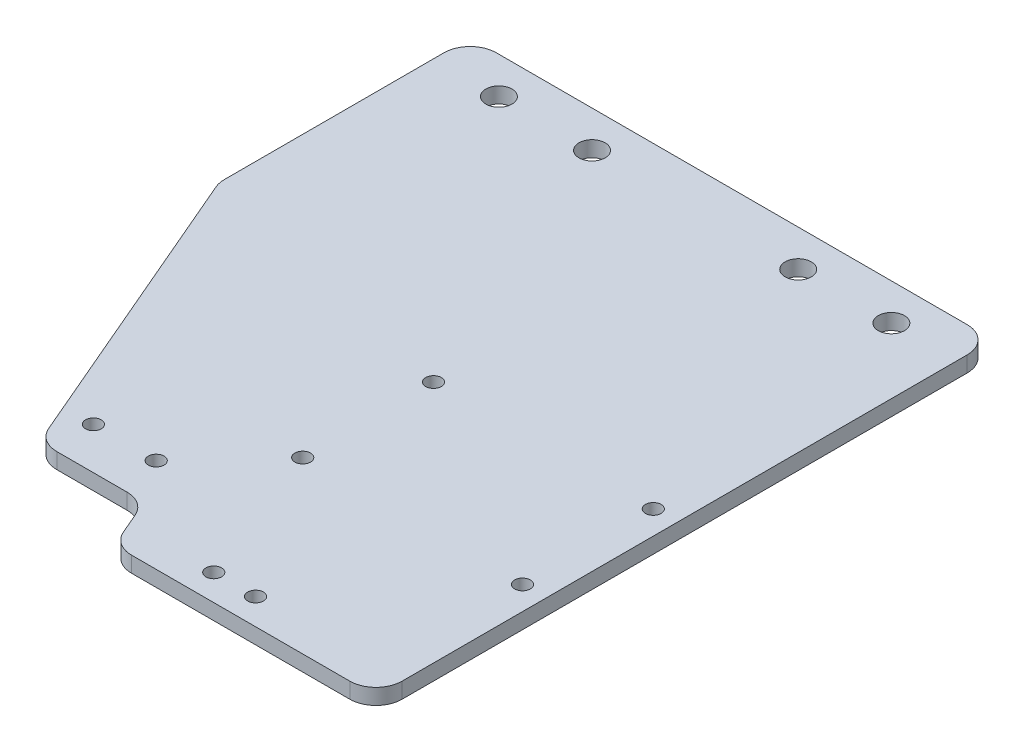
ISO-10303-21;
HEADER;
FILE_DESCRIPTION(('STEP AP214'),'2;1');
FILE_NAME('part.step','',(''),(''),'','','');
FILE_SCHEMA(('AUTOMOTIVE_DESIGN { 1 0 10303 214 1 1 1 1 }'));
ENDSEC;
DATA;
#1=APPLICATION_CONTEXT('core data for automotive mechanical design processes');
#2=APPLICATION_PROTOCOL_DEFINITION('international standard','automotive_design',2000,#1);
#3=PRODUCT_CONTEXT('',#1,'mechanical');
#4=PRODUCT('Part','Part','',(#3));
#5=PRODUCT_RELATED_PRODUCT_CATEGORY('part','',(#4));
#6=PRODUCT_DEFINITION_FORMATION('','',#4);
#7=PRODUCT_DEFINITION_CONTEXT('part definition',#1,'design');
#8=PRODUCT_DEFINITION('design','',#6,#7);
#9=PRODUCT_DEFINITION_SHAPE('','',#8);
#10=(LENGTH_UNIT() NAMED_UNIT(*) SI_UNIT(.MILLI.,.METRE.));
#11=(NAMED_UNIT(*) PLANE_ANGLE_UNIT() SI_UNIT($,.RADIAN.));
#12=(NAMED_UNIT(*) SI_UNIT($,.STERADIAN.) SOLID_ANGLE_UNIT());
#13=UNCERTAINTY_MEASURE_WITH_UNIT(LENGTH_MEASURE(1.E-05),#10,'distance_accuracy_value','');
#14=(GEOMETRIC_REPRESENTATION_CONTEXT(3) GLOBAL_UNCERTAINTY_ASSIGNED_CONTEXT((#13)) GLOBAL_UNIT_ASSIGNED_CONTEXT((#10,
#11,#12)) REPRESENTATION_CONTEXT('',''));
#15=CARTESIAN_POINT('',(0.,0.,0.));
#16=DIRECTION('',(0.,0.,1.));
#17=DIRECTION('',(1.,0.,0.));
#18=AXIS2_PLACEMENT_3D('',#15,#16,#17);
#19=CARTESIAN_POINT('',(-50.,3.,59.));
#20=DIRECTION('',(0.,0.,-1.));
#21=DIRECTION('',(-1.,0.,0.));
#22=AXIS2_PLACEMENT_3D('',#19,#20,#21);
#23=PLANE('',#22);
#24=DIRECTION('',(1.,0.,0.));
#25=VECTOR('',#24,1.);
#26=CARTESIAN_POINT('',(-50.,3.,59.));
#27=LINE('',#26,#25);
#28=CARTESIAN_POINT('',(3.29698078990277,3.,59.));
#29=VERTEX_POINT('',#28);
#30=CARTESIAN_POINT('',(45.,3.,59.));
#31=VERTEX_POINT('',#30);
#32=EDGE_CURVE('E188',#29,#31,#27,.T.);
#33=ORIENTED_EDGE('',*,*,#32,.F.);
#34=DIRECTION('',(0.,1.,0.));
#35=VECTOR('',#34,1.);
#36=CARTESIAN_POINT('',(3.29698078990278,0.,59.));
#37=LINE('',#36,#35);
#38=CARTESIAN_POINT('',(3.29698078990277,0.,59.));
#39=VERTEX_POINT('',#38);
#40=EDGE_CURVE('E229',#29,#39,#37,.F.);
#41=ORIENTED_EDGE('',*,*,#40,.T.);
#42=DIRECTION('',(1.,0.,0.));
#43=VECTOR('',#42,1.);
#44=CARTESIAN_POINT('',(-50.,0.,59.));
#45=LINE('',#44,#43);
#46=CARTESIAN_POINT('',(45.,0.,59.));
#47=VERTEX_POINT('',#46);
#48=EDGE_CURVE('E169',#39,#47,#45,.T.);
#49=ORIENTED_EDGE('',*,*,#48,.T.);
#50=DIRECTION('',(0.,-1.,0.));
#51=VECTOR('',#50,1.);
#52=CARTESIAN_POINT('',(45.,3.,59.));
#53=LINE('',#52,#51);
#54=EDGE_CURVE('E227',#47,#31,#53,.F.);
#55=ORIENTED_EDGE('',*,*,#54,.T.);
#56=EDGE_LOOP('',(#33,#41,#49,#55));
#57=FACE_BOUND('',#56,.T.);
#58=ADVANCED_FACE('F38',(#57),#23,.F.);
#59=CARTESIAN_POINT('',(0.,3.,0.));
#60=DIRECTION('',(0.,1.,0.));
#61=DIRECTION('',(0.,0.,1.));
#62=AXIS2_PLACEMENT_3D('',#59,#60,#61);
#63=PLANE('',#62);
#64=CARTESIAN_POINT('',(-10.,3.,41.));
#65=DIRECTION('',(0.,1.,0.));
#66=DIRECTION('',(0.,0.,-1.));
#67=AXIS2_PLACEMENT_3D('',#64,#65,#66);
#68=CIRCLE('',#67,1.5);
#69=CARTESIAN_POINT('',(-10.,3.,39.5));
#70=VERTEX_POINT('',#69);
#71=EDGE_CURVE('E187',#70,#70,#68,.T.);
#72=ORIENTED_EDGE('',*,*,#71,.F.);
#73=EDGE_LOOP('',(#72));
#74=FACE_BOUND('',#73,.T.);
#75=CARTESIAN_POINT('',(-22.,3.,41.));
#76=DIRECTION('',(0.,1.,0.));
#77=DIRECTION('',(0.,0.,1.));
#78=AXIS2_PLACEMENT_3D('',#75,#76,#77);
#79=CIRCLE('',#78,1.5);
#80=CARTESIAN_POINT('',(-22.,3.,42.5));
#81=VERTEX_POINT('',#80);
#82=EDGE_CURVE('E183',#81,#81,#79,.T.);
#83=ORIENTED_EDGE('',*,*,#82,.F.);
#84=EDGE_LOOP('',(#83));
#85=FACE_BOUND('',#84,.T.);
#86=DIRECTION('',(-1.,0.,0.));
#87=VECTOR('',#86,1.);
#88=CARTESIAN_POINT('',(-50.,3.,-59.));
#89=LINE('',#88,#87);
#90=CARTESIAN_POINT('',(44.9999999999999,3.,-59.));
#91=VERTEX_POINT('',#90);
#92=CARTESIAN_POINT('',(-45.,3.,-59.));
#93=VERTEX_POINT('',#92);
#94=EDGE_CURVE('E332',#91,#93,#89,.T.);
#95=ORIENTED_EDGE('',*,*,#94,.T.);
#96=CARTESIAN_POINT('',(-45.,3.,-54.));
#97=DIRECTION('',(0.,1.,0.));
#98=DIRECTION('',(0.,0.,1.));
#99=AXIS2_PLACEMENT_3D('',#96,#97,#98);
#100=CIRCLE('',#99,5.);
#101=CARTESIAN_POINT('',(-50.,3.,-54.));
#102=VERTEX_POINT('',#101);
#103=EDGE_CURVE('E210',#93,#102,#100,.T.);
#104=ORIENTED_EDGE('',*,*,#103,.T.);
#105=DIRECTION('',(0.,0.,1.));
#106=VECTOR('',#105,1.);
#107=CARTESIAN_POINT('',(-50.,3.,-59.));
#108=LINE('',#107,#106);
#109=CARTESIAN_POINT('',(-50.,3.,-12.0262885097732));
#110=VERTEX_POINT('',#109);
#111=EDGE_CURVE('E161',#102,#110,#108,.T.);
#112=ORIENTED_EDGE('',*,*,#111,.T.);
#113=CARTESIAN_POINT('',(-45.,3.,-12.0262885097732));
#114=DIRECTION('',(0.,1.,0.));
#115=DIRECTION('',(0.,0.,1.));
#116=AXIS2_PLACEMENT_3D('',#113,#114,#115);
#117=CIRCLE('',#116,5.);
#118=CARTESIAN_POINT('',(-49.5957251500903,3.,-10.0566920168774));
#119=VERTEX_POINT('',#118);
#120=EDGE_CURVE('E208',#110,#119,#117,.T.);
#121=ORIENTED_EDGE('',*,*,#120,.T.);
#122=DIRECTION('',(-0.393919298579168,0.,-0.919145030018058));
#123=VECTOR('',#122,1.);
#124=CARTESIAN_POINT('',(-38.2586206896552,3.,16.3965517241379));
#125=LINE('',#124,#123);
#126=CARTESIAN_POINT('',(-25.5844586459018,3.,45.9695964928958));
#127=VERTEX_POINT('',#126);
#128=EDGE_CURVE('E265',#127,#119,#125,.T.);
#129=ORIENTED_EDGE('',*,*,#128,.F.);
#130=CARTESIAN_POINT('',(-20.9887334958115,3.,44.));
#131=DIRECTION('',(0.,1.,0.));
#132=DIRECTION('',(0.,0.,1.));
#133=AXIS2_PLACEMENT_3D('',#130,#131,#132);
#134=CIRCLE('',#133,5.);
#135=CARTESIAN_POINT('',(-20.9887334958115,3.,49.));
#136=VERTEX_POINT('',#135);
#137=EDGE_CURVE('E206',#127,#136,#134,.T.);
#138=ORIENTED_EDGE('',*,*,#137,.T.);
#139=DIRECTION('',(1.,0.,0.));
#140=VECTOR('',#139,1.);
#141=CARTESIAN_POINT('',(0.,3.,49.));
#142=LINE('',#141,#140);
#143=CARTESIAN_POINT('',(-7.5826950756171,3.,49.));
#144=VERTEX_POINT('',#143);
#145=EDGE_CURVE('E241',#136,#144,#142,.T.);
#146=ORIENTED_EDGE('',*,*,#145,.T.);
#147=CARTESIAN_POINT('',(-7.58269507561709,3.,54.));
#148=DIRECTION('',(0.,1.,0.));
#149=DIRECTION('',(0.,0.,1.));
#150=AXIS2_PLACEMENT_3D('',#147,#148,#149);
#151=CIRCLE('',#150,5.);
#152=CARTESIAN_POINT('',(-2.9869699255268,3.,52.0304035071042));
#153=VERTEX_POINT('',#152);
#154=EDGE_CURVE('E46',#144,#153,#151,.F.);
#155=ORIENTED_EDGE('',*,*,#154,.T.);
#156=DIRECTION('',(0.393919298579168,0.,0.919145030018058));
#157=VECTOR('',#156,1.);
#158=CARTESIAN_POINT('',(-21.3620689655172,3.,9.1551724137931));
#159=LINE('',#158,#157);
#160=CARTESIAN_POINT('',(-1.29874436018751,3.,55.9695964928958));
#161=VERTEX_POINT('',#160);
#162=EDGE_CURVE('E182',#153,#161,#159,.T.);
#163=ORIENTED_EDGE('',*,*,#162,.T.);
#164=CARTESIAN_POINT('',(3.29698078990278,3.,54.));
#165=DIRECTION('',(0.,1.,0.));
#166=DIRECTION('',(0.,0.,1.));
#167=AXIS2_PLACEMENT_3D('',#164,#165,#166);
#168=CIRCLE('',#167,5.);
#169=EDGE_CURVE('E204',#161,#29,#168,.T.);
#170=ORIENTED_EDGE('',*,*,#169,.T.);
#171=ORIENTED_EDGE('',*,*,#32,.T.);
#172=CARTESIAN_POINT('',(45.,3.,54.));
#173=DIRECTION('',(0.,1.,0.));
#174=DIRECTION('',(0.,0.,1.));
#175=AXIS2_PLACEMENT_3D('',#172,#173,#174);
#176=CIRCLE('',#175,5.);
#177=CARTESIAN_POINT('',(50.,3.,54.));
#178=VERTEX_POINT('',#177);
#179=EDGE_CURVE('E60',#31,#178,#176,.T.);
#180=ORIENTED_EDGE('',*,*,#179,.T.);
#181=DIRECTION('',(0.,0.,-1.));
#182=VECTOR('',#181,1.);
#183=CARTESIAN_POINT('',(50.,3.,-59.));
#184=LINE('',#183,#182);
#185=CARTESIAN_POINT('',(50.,3.,-54.));
#186=VERTEX_POINT('',#185);
#187=EDGE_CURVE('E173',#178,#186,#184,.T.);
#188=ORIENTED_EDGE('',*,*,#187,.T.);
#189=CARTESIAN_POINT('',(45.,3.,-54.));
#190=DIRECTION('',(0.,1.,0.));
#191=DIRECTION('',(0.,0.,1.));
#192=AXIS2_PLACEMENT_3D('',#189,#190,#191);
#193=CIRCLE('',#192,5.);
#194=EDGE_CURVE('E201',#186,#91,#193,.T.);
#195=ORIENTED_EDGE('',*,*,#194,.T.);
#196=EDGE_LOOP('',(#95,#104,#112,#121,#129,#138,#146,#155,#163,#170,#171,#180,#188,#195));
#197=FACE_BOUND('',#196,.T.);
#198=CARTESIAN_POINT('',(14.,3.,54.));
#199=DIRECTION('',(0.,1.,0.));
#200=DIRECTION('',(0.,0.,-1.));
#201=AXIS2_PLACEMENT_3D('',#198,#199,#200);
#202=CIRCLE('',#201,1.5);
#203=CARTESIAN_POINT('',(14.,3.,52.5));
#204=VERTEX_POINT('',#203);
#205=EDGE_CURVE('E263',#204,#204,#202,.T.);
#206=ORIENTED_EDGE('',*,*,#205,.F.);
#207=EDGE_LOOP('',(#206));
#208=FACE_BOUND('',#207,.T.);
#209=CARTESIAN_POINT('',(22.,3.,54.));
#210=DIRECTION('',(0.,1.,0.));
#211=DIRECTION('',(0.,0.,1.));
#212=AXIS2_PLACEMENT_3D('',#209,#210,#211);
#213=CIRCLE('',#212,1.5);
#214=CARTESIAN_POINT('',(22.,3.,55.5));
#215=VERTEX_POINT('',#214);
#216=EDGE_CURVE('E275',#215,#215,#213,.T.);
#217=ORIENTED_EDGE('',*,*,#216,.F.);
#218=EDGE_LOOP('',(#217));
#219=FACE_BOUND('',#218,.T.);
#220=CARTESIAN_POINT('',(-37.5,3.,-52.));
#221=DIRECTION('',(0.,1.,0.));
#222=DIRECTION('',(0.,0.,-1.));
#223=AXIS2_PLACEMENT_3D('',#220,#221,#222);
#224=CIRCLE('',#223,2.5);
#225=CARTESIAN_POINT('',(-37.5,3.,-54.5));
#226=VERTEX_POINT('',#225);
#227=EDGE_CURVE('E281',#226,#226,#224,.T.);
#228=ORIENTED_EDGE('',*,*,#227,.F.);
#229=EDGE_LOOP('',(#228));
#230=FACE_BOUND('',#229,.T.);
#231=CARTESIAN_POINT('',(-19.7,3.,-52.));
#232=DIRECTION('',(0.,1.,0.));
#233=DIRECTION('',(0.,0.,1.));
#234=AXIS2_PLACEMENT_3D('',#231,#232,#233);
#235=CIRCLE('',#234,2.5);
#236=CARTESIAN_POINT('',(-19.7,3.,-49.5));
#237=VERTEX_POINT('',#236);
#238=EDGE_CURVE('E287',#237,#237,#235,.T.);
#239=ORIENTED_EDGE('',*,*,#238,.F.);
#240=EDGE_LOOP('',(#239));
#241=FACE_BOUND('',#240,.T.);
#242=CARTESIAN_POINT('',(19.7,3.,-52.));
#243=DIRECTION('',(0.,1.,0.));
#244=DIRECTION('',(0.,0.,-1.));
#245=AXIS2_PLACEMENT_3D('',#242,#243,#244);
#246=CIRCLE('',#245,2.5);
#247=CARTESIAN_POINT('',(19.7,3.,-54.5));
#248=VERTEX_POINT('',#247);
#249=EDGE_CURVE('E293',#248,#248,#246,.T.);
#250=ORIENTED_EDGE('',*,*,#249,.F.);
#251=EDGE_LOOP('',(#250));
#252=FACE_BOUND('',#251,.T.);
#253=CARTESIAN_POINT('',(37.5,3.,-52.));
#254=DIRECTION('',(0.,1.,0.));
#255=DIRECTION('',(0.,0.,1.));
#256=AXIS2_PLACEMENT_3D('',#253,#254,#255);
#257=CIRCLE('',#256,2.50000000000001);
#258=CARTESIAN_POINT('',(37.5,3.,-49.5));
#259=VERTEX_POINT('',#258);
#260=EDGE_CURVE('E299',#259,#259,#257,.T.);
#261=ORIENTED_EDGE('',*,*,#260,.F.);
#262=EDGE_LOOP('',(#261));
#263=FACE_BOUND('',#262,.T.);
#264=CARTESIAN_POINT('',(45.5,3.,1.49999999999999));
#265=DIRECTION('',(0.,-1.,0.));
#266=DIRECTION('',(0.,0.,-1.));
#267=AXIS2_PLACEMENT_3D('',#264,#265,#266);
#268=CIRCLE('',#267,1.5);
#269=CARTESIAN_POINT('',(45.5,3.,0.));
#270=VERTEX_POINT('',#269);
#271=EDGE_CURVE('E320',#270,#270,#268,.T.);
#272=ORIENTED_EDGE('',*,*,#271,.T.);
#273=EDGE_LOOP('',(#272));
#274=FACE_BOUND('',#273,.T.);
#275=CARTESIAN_POINT('',(3.49999999999999,3.,1.49999999999999));
#276=DIRECTION('',(0.,1.,0.));
#277=DIRECTION('',(0.,0.,1.));
#278=AXIS2_PLACEMENT_3D('',#275,#276,#277);
#279=CIRCLE('',#278,1.5);
#280=CARTESIAN_POINT('',(3.49999999999999,3.,2.99999999999999));
#281=VERTEX_POINT('',#280);
#282=EDGE_CURVE('E323',#281,#281,#279,.T.);
#283=ORIENTED_EDGE('',*,*,#282,.F.);
#284=EDGE_LOOP('',(#283));
#285=FACE_BOUND('',#284,.T.);
#286=CARTESIAN_POINT('',(45.5,3.,26.5));
#287=DIRECTION('',(0.,1.,0.));
#288=DIRECTION('',(0.,0.,1.));
#289=AXIS2_PLACEMENT_3D('',#286,#287,#288);
#290=CIRCLE('',#289,1.5);
#291=CARTESIAN_POINT('',(45.5,3.,28.));
#292=VERTEX_POINT('',#291);
#293=EDGE_CURVE('E314',#292,#292,#290,.T.);
#294=ORIENTED_EDGE('',*,*,#293,.F.);
#295=EDGE_LOOP('',(#294));
#296=FACE_BOUND('',#295,.T.);
#297=CARTESIAN_POINT('',(3.49999999999999,3.,26.5));
#298=DIRECTION('',(0.,-1.,0.));
#299=DIRECTION('',(0.,0.,-1.));
#300=AXIS2_PLACEMENT_3D('',#297,#298,#299);
#301=CIRCLE('',#300,1.49999999999999);
#302=CARTESIAN_POINT('',(3.49999999999999,3.,25.));
#303=VERTEX_POINT('',#302);
#304=EDGE_CURVE('E308',#303,#303,#301,.T.);
#305=ORIENTED_EDGE('',*,*,#304,.T.);
#306=EDGE_LOOP('',(#305));
#307=FACE_BOUND('',#306,.T.);
#308=ADVANCED_FACE('F238',(#74,#85,#197,#208,#219,#230,#241,#252,#263,#274,#285,#296,#307),#63,.T.);
#309=CARTESIAN_POINT('',(0.,0.,0.));
#310=DIRECTION('',(0.,1.,0.));
#311=DIRECTION('',(0.,0.,1.));
#312=AXIS2_PLACEMENT_3D('',#309,#310,#311);
#313=PLANE('',#312);
#314=CARTESIAN_POINT('',(-10.,0.,41.));
#315=DIRECTION('',(0.,1.,0.));
#316=DIRECTION('',(0.,0.,1.));
#317=AXIS2_PLACEMENT_3D('',#314,#315,#316);
#318=CIRCLE('',#317,1.5);
#319=CARTESIAN_POINT('',(-10.,0.,42.5));
#320=VERTEX_POINT('',#319);
#321=EDGE_CURVE('E184',#320,#320,#318,.T.);
#322=ORIENTED_EDGE('',*,*,#321,.T.);
#323=EDGE_LOOP('',(#322));
#324=FACE_BOUND('',#323,.T.);
#325=CARTESIAN_POINT('',(-22.,0.,41.));
#326=DIRECTION('',(0.,1.,0.));
#327=DIRECTION('',(0.,0.,1.));
#328=AXIS2_PLACEMENT_3D('',#325,#326,#327);
#329=CIRCLE('',#328,1.5);
#330=CARTESIAN_POINT('',(-22.,0.,42.5));
#331=VERTEX_POINT('',#330);
#332=EDGE_CURVE('E179',#331,#331,#329,.T.);
#333=ORIENTED_EDGE('',*,*,#332,.T.);
#334=EDGE_LOOP('',(#333));
#335=FACE_BOUND('',#334,.T.);
#336=CARTESIAN_POINT('',(14.,0.,54.));
#337=DIRECTION('',(0.,1.,0.));
#338=DIRECTION('',(0.,0.,-1.));
#339=AXIS2_PLACEMENT_3D('',#336,#337,#338);
#340=CIRCLE('',#339,1.5);
#341=CARTESIAN_POINT('',(14.,0.,52.5));
#342=VERTEX_POINT('',#341);
#343=EDGE_CURVE('E272',#342,#342,#340,.T.);
#344=ORIENTED_EDGE('',*,*,#343,.T.);
#345=EDGE_LOOP('',(#344));
#346=FACE_BOUND('',#345,.T.);
#347=CARTESIAN_POINT('',(22.,0.,54.));
#348=DIRECTION('',(0.,1.,0.));
#349=DIRECTION('',(0.,0.,1.));
#350=AXIS2_PLACEMENT_3D('',#347,#348,#349);
#351=CIRCLE('',#350,1.5);
#352=CARTESIAN_POINT('',(22.,0.,55.5));
#353=VERTEX_POINT('',#352);
#354=EDGE_CURVE('E278',#353,#353,#351,.T.);
#355=ORIENTED_EDGE('',*,*,#354,.T.);
#356=EDGE_LOOP('',(#355));
#357=FACE_BOUND('',#356,.T.);
#358=CARTESIAN_POINT('',(-37.5,0.,-52.));
#359=DIRECTION('',(0.,1.,0.));
#360=DIRECTION('',(0.,0.,-1.));
#361=AXIS2_PLACEMENT_3D('',#358,#359,#360);
#362=CIRCLE('',#361,2.5);
#363=CARTESIAN_POINT('',(-37.5,0.,-54.5));
#364=VERTEX_POINT('',#363);
#365=EDGE_CURVE('E284',#364,#364,#362,.T.);
#366=ORIENTED_EDGE('',*,*,#365,.T.);
#367=EDGE_LOOP('',(#366));
#368=FACE_BOUND('',#367,.T.);
#369=CARTESIAN_POINT('',(-19.7,0.,-52.));
#370=DIRECTION('',(0.,1.,0.));
#371=DIRECTION('',(0.,0.,1.));
#372=AXIS2_PLACEMENT_3D('',#369,#370,#371);
#373=CIRCLE('',#372,2.5);
#374=CARTESIAN_POINT('',(-19.7,0.,-49.5));
#375=VERTEX_POINT('',#374);
#376=EDGE_CURVE('E290',#375,#375,#373,.T.);
#377=ORIENTED_EDGE('',*,*,#376,.T.);
#378=EDGE_LOOP('',(#377));
#379=FACE_BOUND('',#378,.T.);
#380=CARTESIAN_POINT('',(19.7,0.,-52.));
#381=DIRECTION('',(0.,1.,0.));
#382=DIRECTION('',(0.,0.,-1.));
#383=AXIS2_PLACEMENT_3D('',#380,#381,#382);
#384=CIRCLE('',#383,2.5);
#385=CARTESIAN_POINT('',(19.7,0.,-54.5));
#386=VERTEX_POINT('',#385);
#387=EDGE_CURVE('E296',#386,#386,#384,.T.);
#388=ORIENTED_EDGE('',*,*,#387,.T.);
#389=EDGE_LOOP('',(#388));
#390=FACE_BOUND('',#389,.T.);
#391=CARTESIAN_POINT('',(37.5,0.,-52.));
#392=DIRECTION('',(0.,1.,0.));
#393=DIRECTION('',(0.,0.,1.));
#394=AXIS2_PLACEMENT_3D('',#391,#392,#393);
#395=CIRCLE('',#394,2.50000000000001);
#396=CARTESIAN_POINT('',(37.5,0.,-49.5));
#397=VERTEX_POINT('',#396);
#398=EDGE_CURVE('E302',#397,#397,#395,.T.);
#399=ORIENTED_EDGE('',*,*,#398,.T.);
#400=EDGE_LOOP('',(#399));
#401=FACE_BOUND('',#400,.T.);
#402=CARTESIAN_POINT('',(45.5,0.,26.5));
#403=DIRECTION('',(0.,1.,0.));
#404=DIRECTION('',(0.,0.,1.));
#405=AXIS2_PLACEMENT_3D('',#402,#403,#404);
#406=CIRCLE('',#405,1.5);
#407=CARTESIAN_POINT('',(45.5,0.,28.));
#408=VERTEX_POINT('',#407);
#409=EDGE_CURVE('E311',#408,#408,#406,.T.);
#410=ORIENTED_EDGE('',*,*,#409,.T.);
#411=EDGE_LOOP('',(#410));
#412=FACE_BOUND('',#411,.T.);
#413=CARTESIAN_POINT('',(3.49999999999999,0.,1.49999999999999));
#414=DIRECTION('',(0.,1.,0.));
#415=DIRECTION('',(0.,0.,1.));
#416=AXIS2_PLACEMENT_3D('',#413,#414,#415);
#417=CIRCLE('',#416,1.5);
#418=CARTESIAN_POINT('',(3.49999999999999,0.,2.99999999999999));
#419=VERTEX_POINT('',#418);
#420=EDGE_CURVE('E326',#419,#419,#417,.T.);
#421=ORIENTED_EDGE('',*,*,#420,.T.);
#422=EDGE_LOOP('',(#421));
#423=FACE_BOUND('',#422,.T.);
#424=DIRECTION('',(0.,0.,1.));
#425=VECTOR('',#424,1.);
#426=CARTESIAN_POINT('',(-50.,0.,-59.));
#427=LINE('',#426,#425);
#428=CARTESIAN_POINT('',(-50.,0.,-54.));
#429=VERTEX_POINT('',#428);
#430=CARTESIAN_POINT('',(-50.,0.,-12.0262885097732));
#431=VERTEX_POINT('',#430);
#432=EDGE_CURVE('E158',#429,#431,#427,.T.);
#433=ORIENTED_EDGE('',*,*,#432,.F.);
#434=CARTESIAN_POINT('',(-45.,0.,-54.));
#435=DIRECTION('',(0.,1.,0.));
#436=DIRECTION('',(0.,0.,1.));
#437=AXIS2_PLACEMENT_3D('',#434,#435,#436);
#438=CIRCLE('',#437,5.);
#439=CARTESIAN_POINT('',(-45.,0.,-59.));
#440=VERTEX_POINT('',#439);
#441=EDGE_CURVE('E140',#429,#440,#438,.F.);
#442=ORIENTED_EDGE('',*,*,#441,.T.);
#443=DIRECTION('',(-1.,0.,0.));
#444=VECTOR('',#443,1.);
#445=CARTESIAN_POINT('',(-50.,0.,-59.));
#446=LINE('',#445,#444);
#447=CARTESIAN_POINT('',(44.9999999999999,0.,-59.));
#448=VERTEX_POINT('',#447);
#449=EDGE_CURVE('E170',#448,#440,#446,.T.);
#450=ORIENTED_EDGE('',*,*,#449,.F.);
#451=CARTESIAN_POINT('',(45.,0.,-54.));
#452=DIRECTION('',(0.,1.,0.));
#453=DIRECTION('',(0.,0.,1.));
#454=AXIS2_PLACEMENT_3D('',#451,#452,#453);
#455=CIRCLE('',#454,5.);
#456=CARTESIAN_POINT('',(50.,0.,-54.));
#457=VERTEX_POINT('',#456);
#458=EDGE_CURVE('E162',#448,#457,#455,.F.);
#459=ORIENTED_EDGE('',*,*,#458,.T.);
#460=DIRECTION('',(0.,0.,-1.));
#461=VECTOR('',#460,1.);
#462=CARTESIAN_POINT('',(50.,0.,-59.));
#463=LINE('',#462,#461);
#464=CARTESIAN_POINT('',(50.,0.,54.));
#465=VERTEX_POINT('',#464);
#466=EDGE_CURVE('E175',#465,#457,#463,.T.);
#467=ORIENTED_EDGE('',*,*,#466,.F.);
#468=CARTESIAN_POINT('',(45.,0.,54.));
#469=DIRECTION('',(0.,1.,0.));
#470=DIRECTION('',(0.,0.,1.));
#471=AXIS2_PLACEMENT_3D('',#468,#469,#470);
#472=CIRCLE('',#471,5.);
#473=EDGE_CURVE('E191',#465,#47,#472,.F.);
#474=ORIENTED_EDGE('',*,*,#473,.T.);
#475=ORIENTED_EDGE('',*,*,#48,.F.);
#476=CARTESIAN_POINT('',(3.29698078990278,0.,54.));
#477=DIRECTION('',(0.,1.,0.));
#478=DIRECTION('',(0.,0.,1.));
#479=AXIS2_PLACEMENT_3D('',#476,#477,#478);
#480=CIRCLE('',#479,5.);
#481=CARTESIAN_POINT('',(-1.29874436018751,0.,55.9695964928958));
#482=VERTEX_POINT('',#481);
#483=EDGE_CURVE('E193',#39,#482,#480,.F.);
#484=ORIENTED_EDGE('',*,*,#483,.T.);
#485=DIRECTION('',(0.393919298579168,0.,0.919145030018058));
#486=VECTOR('',#485,1.);
#487=CARTESIAN_POINT('',(-21.3620689655172,0.,9.1551724137931));
#488=LINE('',#487,#486);
#489=CARTESIAN_POINT('',(-2.9869699255268,0.,52.0304035071042));
#490=VERTEX_POINT('',#489);
#491=EDGE_CURVE('E257',#490,#482,#488,.T.);
#492=ORIENTED_EDGE('',*,*,#491,.F.);
#493=CARTESIAN_POINT('',(-7.58269507561709,0.,54.));
#494=DIRECTION('',(0.,1.,0.));
#495=DIRECTION('',(0.,0.,1.));
#496=AXIS2_PLACEMENT_3D('',#493,#494,#495);
#497=CIRCLE('',#496,5.);
#498=CARTESIAN_POINT('',(-7.5826950756171,0.,49.));
#499=VERTEX_POINT('',#498);
#500=EDGE_CURVE('E11',#490,#499,#497,.T.);
#501=ORIENTED_EDGE('',*,*,#500,.T.);
#502=DIRECTION('',(1.,0.,0.));
#503=VECTOR('',#502,1.);
#504=CARTESIAN_POINT('',(0.,0.,49.));
#505=LINE('',#504,#503);
#506=CARTESIAN_POINT('',(-20.9887334958115,0.,49.));
#507=VERTEX_POINT('',#506);
#508=EDGE_CURVE('E255',#507,#499,#505,.T.);
#509=ORIENTED_EDGE('',*,*,#508,.F.);
#510=CARTESIAN_POINT('',(-20.9887334958115,0.,44.));
#511=DIRECTION('',(0.,1.,0.));
#512=DIRECTION('',(0.,0.,1.));
#513=AXIS2_PLACEMENT_3D('',#510,#511,#512);
#514=CIRCLE('',#513,5.);
#515=CARTESIAN_POINT('',(-25.5844586459018,0.,45.9695964928958));
#516=VERTEX_POINT('',#515);
#517=EDGE_CURVE('E195',#507,#516,#514,.F.);
#518=ORIENTED_EDGE('',*,*,#517,.T.);
#519=DIRECTION('',(-0.393919298579168,0.,-0.919145030018058));
#520=VECTOR('',#519,1.);
#521=CARTESIAN_POINT('',(-38.2586206896552,0.,16.3965517241379));
#522=LINE('',#521,#520);
#523=CARTESIAN_POINT('',(-49.5957251500903,0.,-10.0566920168774));
#524=VERTEX_POINT('',#523);
#525=EDGE_CURVE('E261',#516,#524,#522,.T.);
#526=ORIENTED_EDGE('',*,*,#525,.T.);
#527=CARTESIAN_POINT('',(-45.,0.,-12.0262885097732));
#528=DIRECTION('',(0.,1.,0.));
#529=DIRECTION('',(0.,0.,1.));
#530=AXIS2_PLACEMENT_3D('',#527,#528,#529);
#531=CIRCLE('',#530,5.);
#532=EDGE_CURVE('E151',#524,#431,#531,.F.);
#533=ORIENTED_EDGE('',*,*,#532,.T.);
#534=EDGE_LOOP('',(#433,#442,#450,#459,#467,#474,#475,#484,#492,#501,#509,#518,#526,#533));
#535=FACE_BOUND('',#534,.T.);
#536=CARTESIAN_POINT('',(45.5,0.,1.49999999999999));
#537=DIRECTION('',(0.,-1.,0.));
#538=DIRECTION('',(0.,0.,-1.));
#539=AXIS2_PLACEMENT_3D('',#536,#537,#538);
#540=CIRCLE('',#539,1.5);
#541=CARTESIAN_POINT('',(45.5,0.,0.));
#542=VERTEX_POINT('',#541);
#543=EDGE_CURVE('E317',#542,#542,#540,.T.);
#544=ORIENTED_EDGE('',*,*,#543,.F.);
#545=EDGE_LOOP('',(#544));
#546=FACE_BOUND('',#545,.T.);
#547=CARTESIAN_POINT('',(3.49999999999999,0.,26.5));
#548=DIRECTION('',(0.,-1.,0.));
#549=DIRECTION('',(0.,0.,-1.));
#550=AXIS2_PLACEMENT_3D('',#547,#548,#549);
#551=CIRCLE('',#550,1.49999999999999);
#552=CARTESIAN_POINT('',(3.49999999999999,0.,25.));
#553=VERTEX_POINT('',#552);
#554=EDGE_CURVE('E305',#553,#553,#551,.T.);
#555=ORIENTED_EDGE('',*,*,#554,.F.);
#556=EDGE_LOOP('',(#555));
#557=FACE_BOUND('',#556,.T.);
#558=ADVANCED_FACE('F165',(#324,#335,#346,#357,#368,#379,#390,#401,#412,#423,#535,#546,#557),
#313,.F.);
#559=CARTESIAN_POINT('',(50.,3.,-59.));
#560=DIRECTION('',(-1.,0.,0.));
#561=DIRECTION('',(0.,0.,1.));
#562=AXIS2_PLACEMENT_3D('',#559,#560,#561);
#563=PLANE('',#562);
#564=ORIENTED_EDGE('',*,*,#187,.F.);
#565=DIRECTION('',(0.,-1.,0.));
#566=VECTOR('',#565,1.);
#567=CARTESIAN_POINT('',(50.,3.,54.));
#568=LINE('',#567,#566);
#569=EDGE_CURVE('E232',#178,#465,#568,.T.);
#570=ORIENTED_EDGE('',*,*,#569,.T.);
#571=ORIENTED_EDGE('',*,*,#466,.T.);
#572=DIRECTION('',(0.,-1.,0.));
#573=VECTOR('',#572,1.);
#574=CARTESIAN_POINT('',(50.,3.,-54.));
#575=LINE('',#574,#573);
#576=EDGE_CURVE('E53',#457,#186,#575,.F.);
#577=ORIENTED_EDGE('',*,*,#576,.T.);
#578=EDGE_LOOP('',(#564,#570,#571,#577));
#579=FACE_BOUND('',#578,.T.);
#580=ADVANCED_FACE('F336',(#579),#563,.F.);
#581=CARTESIAN_POINT('',(-50.,3.,-59.));
#582=DIRECTION('',(0.,0.,1.));
#583=DIRECTION('',(1.,0.,0.));
#584=AXIS2_PLACEMENT_3D('',#581,#582,#583);
#585=PLANE('',#584);
#586=ORIENTED_EDGE('',*,*,#449,.T.);
#587=DIRECTION('',(0.,-1.,0.));
#588=VECTOR('',#587,1.);
#589=CARTESIAN_POINT('',(-45.,3.,-59.));
#590=LINE('',#589,#588);
#591=EDGE_CURVE('E145',#440,#93,#590,.F.);
#592=ORIENTED_EDGE('',*,*,#591,.T.);
#593=ORIENTED_EDGE('',*,*,#94,.F.);
#594=DIRECTION('',(0.,-1.,0.));
#595=VECTOR('',#594,1.);
#596=CARTESIAN_POINT('',(45.,3.,-59.));
#597=LINE('',#596,#595);
#598=EDGE_CURVE('E150',#91,#448,#597,.T.);
#599=ORIENTED_EDGE('',*,*,#598,.T.);
#600=EDGE_LOOP('',(#586,#592,#593,#599));
#601=FACE_BOUND('',#600,.T.);
#602=ADVANCED_FACE('F343',(#601),#585,.F.);
#603=CARTESIAN_POINT('',(-50.,3.,-59.));
#604=DIRECTION('',(1.,0.,0.));
#605=DIRECTION('',(0.,0.,-1.));
#606=AXIS2_PLACEMENT_3D('',#603,#604,#605);
#607=PLANE('',#606);
#608=ORIENTED_EDGE('',*,*,#111,.F.);
#609=DIRECTION('',(0.,-1.,0.));
#610=VECTOR('',#609,1.);
#611=CARTESIAN_POINT('',(-50.,3.,-54.));
#612=LINE('',#611,#610);
#613=EDGE_CURVE('E144',#102,#429,#612,.T.);
#614=ORIENTED_EDGE('',*,*,#613,.T.);
#615=ORIENTED_EDGE('',*,*,#432,.T.);
#616=DIRECTION('',(0.,1.,0.));
#617=VECTOR('',#616,1.);
#618=CARTESIAN_POINT('',(-50.,3.,-12.0262885097732));
#619=LINE('',#618,#617);
#620=EDGE_CURVE('E163',#431,#110,#619,.T.);
#621=ORIENTED_EDGE('',*,*,#620,.T.);
#622=EDGE_LOOP('',(#608,#614,#615,#621));
#623=FACE_BOUND('',#622,.T.);
#624=ADVANCED_FACE('F156',(#623),#607,.F.);
#625=CARTESIAN_POINT('',(3.49999999999999,0.,1.49999999999999));
#626=DIRECTION('',(0.,1.,0.));
#627=DIRECTION('',(0.,0.,1.));
#628=AXIS2_PLACEMENT_3D('',#625,#626,#627);
#629=CYLINDRICAL_SURFACE('',#628,1.5);
#630=ORIENTED_EDGE('',*,*,#420,.F.);
#631=EDGE_LOOP('',(#630));
#632=FACE_BOUND('',#631,.T.);
#633=ORIENTED_EDGE('',*,*,#282,.T.);
#634=EDGE_LOOP('',(#633));
#635=FACE_BOUND('',#634,.T.);
#636=ADVANCED_FACE('F350',(#632,#635),#629,.F.);
#637=CARTESIAN_POINT('',(45.5,0.,1.49999999999999));
#638=DIRECTION('',(0.,1.,0.));
#639=DIRECTION('',(0.,0.,1.));
#640=AXIS2_PLACEMENT_3D('',#637,#638,#639);
#641=CYLINDRICAL_SURFACE('',#640,1.5);
#642=ORIENTED_EDGE('',*,*,#543,.T.);
#643=EDGE_LOOP('',(#642));
#644=FACE_BOUND('',#643,.T.);
#645=ORIENTED_EDGE('',*,*,#271,.F.);
#646=EDGE_LOOP('',(#645));
#647=FACE_BOUND('',#646,.T.);
#648=ADVANCED_FACE('F368',(#644,#647),#641,.F.);
#649=CARTESIAN_POINT('',(45.5,0.,26.5));
#650=DIRECTION('',(0.,1.,0.));
#651=DIRECTION('',(0.,0.,1.));
#652=AXIS2_PLACEMENT_3D('',#649,#650,#651);
#653=CYLINDRICAL_SURFACE('',#652,1.5);
#654=ORIENTED_EDGE('',*,*,#409,.F.);
#655=EDGE_LOOP('',(#654));
#656=FACE_BOUND('',#655,.T.);
#657=ORIENTED_EDGE('',*,*,#293,.T.);
#658=EDGE_LOOP('',(#657));
#659=FACE_BOUND('',#658,.T.);
#660=ADVANCED_FACE('F372',(#656,#659),#653,.F.);
#661=CARTESIAN_POINT('',(3.49999999999999,0.,26.5));
#662=DIRECTION('',(0.,1.,0.));
#663=DIRECTION('',(0.,0.,1.));
#664=AXIS2_PLACEMENT_3D('',#661,#662,#663);
#665=CYLINDRICAL_SURFACE('',#664,1.49999999999999);
#666=ORIENTED_EDGE('',*,*,#554,.T.);
#667=EDGE_LOOP('',(#666));
#668=FACE_BOUND('',#667,.T.);
#669=ORIENTED_EDGE('',*,*,#304,.F.);
#670=EDGE_LOOP('',(#669));
#671=FACE_BOUND('',#670,.T.);
#672=ADVANCED_FACE('F376',(#668,#671),#665,.F.);
#673=CARTESIAN_POINT('',(37.5,0.,-52.));
#674=DIRECTION('',(0.,1.,0.));
#675=DIRECTION('',(0.,0.,1.));
#676=AXIS2_PLACEMENT_3D('',#673,#674,#675);
#677=CYLINDRICAL_SURFACE('',#676,2.50000000000001);
#678=ORIENTED_EDGE('',*,*,#398,.F.);
#679=EDGE_LOOP('',(#678));
#680=FACE_BOUND('',#679,.T.);
#681=ORIENTED_EDGE('',*,*,#260,.T.);
#682=EDGE_LOOP('',(#681));
#683=FACE_BOUND('',#682,.T.);
#684=ADVANCED_FACE('F380',(#680,#683),#677,.F.);
#685=CARTESIAN_POINT('',(19.7,0.,-52.));
#686=DIRECTION('',(0.,1.,0.));
#687=DIRECTION('',(0.,0.,1.));
#688=AXIS2_PLACEMENT_3D('',#685,#686,#687);
#689=CYLINDRICAL_SURFACE('',#688,2.5);
#690=ORIENTED_EDGE('',*,*,#387,.F.);
#691=EDGE_LOOP('',(#690));
#692=FACE_BOUND('',#691,.T.);
#693=ORIENTED_EDGE('',*,*,#249,.T.);
#694=EDGE_LOOP('',(#693));
#695=FACE_BOUND('',#694,.T.);
#696=ADVANCED_FACE('F384',(#692,#695),#689,.F.);
#697=CARTESIAN_POINT('',(-19.7,0.,-52.));
#698=DIRECTION('',(0.,1.,0.));
#699=DIRECTION('',(0.,0.,1.));
#700=AXIS2_PLACEMENT_3D('',#697,#698,#699);
#701=CYLINDRICAL_SURFACE('',#700,2.5);
#702=ORIENTED_EDGE('',*,*,#376,.F.);
#703=EDGE_LOOP('',(#702));
#704=FACE_BOUND('',#703,.T.);
#705=ORIENTED_EDGE('',*,*,#238,.T.);
#706=EDGE_LOOP('',(#705));
#707=FACE_BOUND('',#706,.T.);
#708=ADVANCED_FACE('F388',(#704,#707),#701,.F.);
#709=CARTESIAN_POINT('',(-37.5,0.,-52.));
#710=DIRECTION('',(0.,1.,0.));
#711=DIRECTION('',(0.,0.,1.));
#712=AXIS2_PLACEMENT_3D('',#709,#710,#711);
#713=CYLINDRICAL_SURFACE('',#712,2.5);
#714=ORIENTED_EDGE('',*,*,#365,.F.);
#715=EDGE_LOOP('',(#714));
#716=FACE_BOUND('',#715,.T.);
#717=ORIENTED_EDGE('',*,*,#227,.T.);
#718=EDGE_LOOP('',(#717));
#719=FACE_BOUND('',#718,.T.);
#720=ADVANCED_FACE('F392',(#716,#719),#713,.F.);
#721=CARTESIAN_POINT('',(22.,0.,54.));
#722=DIRECTION('',(0.,1.,0.));
#723=DIRECTION('',(0.,0.,1.));
#724=AXIS2_PLACEMENT_3D('',#721,#722,#723);
#725=CYLINDRICAL_SURFACE('',#724,1.5);
#726=ORIENTED_EDGE('',*,*,#354,.F.);
#727=EDGE_LOOP('',(#726));
#728=FACE_BOUND('',#727,.T.);
#729=ORIENTED_EDGE('',*,*,#216,.T.);
#730=EDGE_LOOP('',(#729));
#731=FACE_BOUND('',#730,.T.);
#732=ADVANCED_FACE('F396',(#728,#731),#725,.F.);
#733=CARTESIAN_POINT('',(14.,0.,54.));
#734=DIRECTION('',(0.,1.,0.));
#735=DIRECTION('',(0.,0.,1.));
#736=AXIS2_PLACEMENT_3D('',#733,#734,#735);
#737=CYLINDRICAL_SURFACE('',#736,1.5);
#738=ORIENTED_EDGE('',*,*,#343,.F.);
#739=EDGE_LOOP('',(#738));
#740=FACE_BOUND('',#739,.T.);
#741=ORIENTED_EDGE('',*,*,#205,.T.);
#742=EDGE_LOOP('',(#741));
#743=FACE_BOUND('',#742,.T.);
#744=ADVANCED_FACE('F400',(#740,#743),#737,.F.);
#745=CARTESIAN_POINT('',(-38.2586206896552,0.,16.3965517241379));
#746=DIRECTION('',(0.919145030018058,0.,-0.393919298579168));
#747=DIRECTION('',(-0.393919298579168,0.,-0.919145030018058));
#748=AXIS2_PLACEMENT_3D('',#745,#746,#747);
#749=PLANE('',#748);
#750=ORIENTED_EDGE('',*,*,#128,.T.);
#751=DIRECTION('',(0.,1.,0.));
#752=VECTOR('',#751,1.);
#753=CARTESIAN_POINT('',(-49.5957251500903,0.,-10.0566920168774));
#754=LINE('',#753,#752);
#755=EDGE_CURVE('E215',#119,#524,#754,.F.);
#756=ORIENTED_EDGE('',*,*,#755,.T.);
#757=ORIENTED_EDGE('',*,*,#525,.F.);
#758=DIRECTION('',(0.,1.,0.));
#759=VECTOR('',#758,1.);
#760=CARTESIAN_POINT('',(-25.5844586459018,3.,45.9695964928958));
#761=LINE('',#760,#759);
#762=EDGE_CURVE('E212',#516,#127,#761,.T.);
#763=ORIENTED_EDGE('',*,*,#762,.T.);
#764=EDGE_LOOP('',(#750,#756,#757,#763));
#765=FACE_BOUND('',#764,.T.);
#766=ADVANCED_FACE('F404',(#765),#749,.F.);
#767=CARTESIAN_POINT('',(0.,0.,49.));
#768=DIRECTION('',(0.,0.,1.));
#769=DIRECTION('',(1.,0.,0.));
#770=AXIS2_PLACEMENT_3D('',#767,#768,#769);
#771=PLANE('',#770);
#772=ORIENTED_EDGE('',*,*,#145,.F.);
#773=DIRECTION('',(0.,1.,0.));
#774=VECTOR('',#773,1.);
#775=CARTESIAN_POINT('',(-20.9887334958115,0.,49.));
#776=LINE('',#775,#774);
#777=EDGE_CURVE('E220',#136,#507,#776,.F.);
#778=ORIENTED_EDGE('',*,*,#777,.T.);
#779=ORIENTED_EDGE('',*,*,#508,.T.);
#780=DIRECTION('',(0.,1.,0.));
#781=VECTOR('',#780,1.);
#782=CARTESIAN_POINT('',(-7.5826950756171,3.,49.));
#783=LINE('',#782,#781);
#784=EDGE_CURVE('E217',#499,#144,#783,.T.);
#785=ORIENTED_EDGE('',*,*,#784,.T.);
#786=EDGE_LOOP('',(#772,#778,#779,#785));
#787=FACE_BOUND('',#786,.T.);
#788=ADVANCED_FACE('F259',(#787),#771,.T.);
#789=CARTESIAN_POINT('',(-21.3620689655172,0.,9.1551724137931));
#790=DIRECTION('',(-0.919145030018058,0.,0.393919298579168));
#791=DIRECTION('',(0.393919298579168,0.,0.919145030018058));
#792=AXIS2_PLACEMENT_3D('',#789,#790,#791);
#793=PLANE('',#792);
#794=ORIENTED_EDGE('',*,*,#162,.F.);
#795=DIRECTION('',(0.,1.,0.));
#796=VECTOR('',#795,1.);
#797=CARTESIAN_POINT('',(-2.98696992552681,0.,52.0304035071041));
#798=LINE('',#797,#796);
#799=EDGE_CURVE('E225',#153,#490,#798,.F.);
#800=ORIENTED_EDGE('',*,*,#799,.T.);
#801=ORIENTED_EDGE('',*,*,#491,.T.);
#802=DIRECTION('',(0.,1.,0.));
#803=VECTOR('',#802,1.);
#804=CARTESIAN_POINT('',(-1.29874436018751,3.,55.9695964928958));
#805=LINE('',#804,#803);
#806=EDGE_CURVE('E222',#482,#161,#805,.T.);
#807=ORIENTED_EDGE('',*,*,#806,.T.);
#808=EDGE_LOOP('',(#794,#800,#801,#807));
#809=FACE_BOUND('',#808,.T.);
#810=ADVANCED_FACE('F246',(#809),#793,.T.);
#811=CARTESIAN_POINT('',(-22.,-7.,41.));
#812=DIRECTION('',(0.,1.,0.));
#813=DIRECTION('',(0.,0.,1.));
#814=AXIS2_PLACEMENT_3D('',#811,#812,#813);
#815=CYLINDRICAL_SURFACE('',#814,1.5);
#816=ORIENTED_EDGE('',*,*,#82,.T.);
#817=EDGE_LOOP('',(#816));
#818=FACE_BOUND('',#817,.T.);
#819=ORIENTED_EDGE('',*,*,#332,.F.);
#820=EDGE_LOOP('',(#819));
#821=FACE_BOUND('',#820,.T.);
#822=ADVANCED_FACE('F408',(#818,#821),#815,.F.);
#823=CARTESIAN_POINT('',(-10.,-7.,41.));
#824=DIRECTION('',(0.,1.,0.));
#825=DIRECTION('',(0.,0.,1.));
#826=AXIS2_PLACEMENT_3D('',#823,#824,#825);
#827=CYLINDRICAL_SURFACE('',#826,1.5);
#828=ORIENTED_EDGE('',*,*,#71,.T.);
#829=EDGE_LOOP('',(#828));
#830=FACE_BOUND('',#829,.T.);
#831=ORIENTED_EDGE('',*,*,#321,.F.);
#832=EDGE_LOOP('',(#831));
#833=FACE_BOUND('',#832,.T.);
#834=ADVANCED_FACE('F416',(#830,#833),#827,.F.);
#835=CARTESIAN_POINT('',(-45.,3.,-54.));
#836=DIRECTION('',(0.,-1.,0.));
#837=DIRECTION('',(0.,0.,-1.));
#838=AXIS2_PLACEMENT_3D('',#835,#836,#837);
#839=CYLINDRICAL_SURFACE('',#838,5.);
#840=ORIENTED_EDGE('',*,*,#103,.F.);
#841=ORIENTED_EDGE('',*,*,#591,.F.);
#842=ORIENTED_EDGE('',*,*,#441,.F.);
#843=ORIENTED_EDGE('',*,*,#613,.F.);
#844=EDGE_LOOP('',(#840,#841,#842,#843));
#845=FACE_BOUND('',#844,.T.);
#846=ADVANCED_FACE('F143',(#845),#839,.T.);
#847=CARTESIAN_POINT('',(-45.,3.,-12.0262885097732));
#848=DIRECTION('',(0.,1.,0.));
#849=DIRECTION('',(0.,0.,1.));
#850=AXIS2_PLACEMENT_3D('',#847,#848,#849);
#851=CYLINDRICAL_SURFACE('',#850,5.);
#852=ORIENTED_EDGE('',*,*,#532,.F.);
#853=ORIENTED_EDGE('',*,*,#755,.F.);
#854=ORIENTED_EDGE('',*,*,#120,.F.);
#855=ORIENTED_EDGE('',*,*,#620,.F.);
#856=EDGE_LOOP('',(#852,#853,#854,#855));
#857=FACE_BOUND('',#856,.T.);
#858=ADVANCED_FACE('F423',(#857),#851,.T.);
#859=CARTESIAN_POINT('',(-20.9887334958115,0.,44.));
#860=DIRECTION('',(0.,-1.,0.));
#861=DIRECTION('',(0.,0.,-1.));
#862=AXIS2_PLACEMENT_3D('',#859,#860,#861);
#863=CYLINDRICAL_SURFACE('',#862,5.);
#864=ORIENTED_EDGE('',*,*,#517,.F.);
#865=ORIENTED_EDGE('',*,*,#777,.F.);
#866=ORIENTED_EDGE('',*,*,#137,.F.);
#867=ORIENTED_EDGE('',*,*,#762,.F.);
#868=EDGE_LOOP('',(#864,#865,#866,#867));
#869=FACE_BOUND('',#868,.T.);
#870=ADVANCED_FACE('F484',(#869),#863,.T.);
#871=CARTESIAN_POINT('',(-7.58269507561709,0.,54.));
#872=DIRECTION('',(0.,-1.,0.));
#873=DIRECTION('',(0.,0.,-1.));
#874=AXIS2_PLACEMENT_3D('',#871,#872,#873);
#875=CYLINDRICAL_SURFACE('',#874,5.);
#876=ORIENTED_EDGE('',*,*,#500,.F.);
#877=ORIENTED_EDGE('',*,*,#799,.F.);
#878=ORIENTED_EDGE('',*,*,#154,.F.);
#879=ORIENTED_EDGE('',*,*,#784,.F.);
#880=EDGE_LOOP('',(#876,#877,#878,#879));
#881=FACE_BOUND('',#880,.T.);
#882=ADVANCED_FACE('F252',(#881),#875,.F.);
#883=CARTESIAN_POINT('',(3.29698078990278,0.,54.));
#884=DIRECTION('',(0.,-1.,0.));
#885=DIRECTION('',(0.,0.,-1.));
#886=AXIS2_PLACEMENT_3D('',#883,#884,#885);
#887=CYLINDRICAL_SURFACE('',#886,5.);
#888=ORIENTED_EDGE('',*,*,#483,.F.);
#889=ORIENTED_EDGE('',*,*,#40,.F.);
#890=ORIENTED_EDGE('',*,*,#169,.F.);
#891=ORIENTED_EDGE('',*,*,#806,.F.);
#892=EDGE_LOOP('',(#888,#889,#890,#891));
#893=FACE_BOUND('',#892,.T.);
#894=ADVANCED_FACE('F493',(#893),#887,.T.);
#895=CARTESIAN_POINT('',(45.,3.,54.));
#896=DIRECTION('',(0.,-1.,0.));
#897=DIRECTION('',(0.,0.,-1.));
#898=AXIS2_PLACEMENT_3D('',#895,#896,#897);
#899=CYLINDRICAL_SURFACE('',#898,5.);
#900=ORIENTED_EDGE('',*,*,#179,.F.);
#901=ORIENTED_EDGE('',*,*,#54,.F.);
#902=ORIENTED_EDGE('',*,*,#473,.F.);
#903=ORIENTED_EDGE('',*,*,#569,.F.);
#904=EDGE_LOOP('',(#900,#901,#902,#903));
#905=FACE_BOUND('',#904,.T.);
#906=ADVANCED_FACE('F495',(#905),#899,.T.);
#907=CARTESIAN_POINT('',(45.,3.,-54.));
#908=DIRECTION('',(0.,-1.,0.));
#909=DIRECTION('',(0.,0.,-1.));
#910=AXIS2_PLACEMENT_3D('',#907,#908,#909);
#911=CYLINDRICAL_SURFACE('',#910,5.);
#912=ORIENTED_EDGE('',*,*,#194,.F.);
#913=ORIENTED_EDGE('',*,*,#576,.F.);
#914=ORIENTED_EDGE('',*,*,#458,.F.);
#915=ORIENTED_EDGE('',*,*,#598,.F.);
#916=EDGE_LOOP('',(#912,#913,#914,#915));
#917=FACE_BOUND('',#916,.T.);
#918=ADVANCED_FACE('F40',(#917),#911,.T.);
#919=CLOSED_SHELL('',(#58,#308,#558,#580,#602,#624,#636,#648,#660,#672,#684,#696,#708,#720,#732,
#744,#766,#788,#810,#822,#834,#846,#858,#870,#882,#894,#906,#918));
#920=MANIFOLD_SOLID_BREP('B2',#919);
#921=ADVANCED_BREP_SHAPE_REPRESENTATION('',(#18,#920),#14);
#922=SHAPE_DEFINITION_REPRESENTATION(#9,#921);
ENDSEC;
END-ISO-10303-21;
